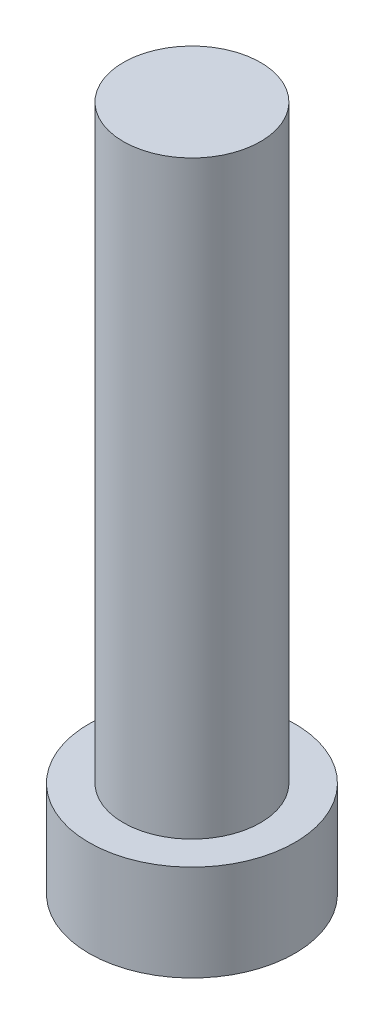
ISO-10303-21;
HEADER;
FILE_DESCRIPTION(('STEP AP214'),'2;1');
FILE_NAME('part.step','',(''),(''),'','','');
FILE_SCHEMA(('AUTOMOTIVE_DESIGN { 1 0 10303 214 1 1 1 1 }'));
ENDSEC;
DATA;
#1=APPLICATION_CONTEXT('core data for automotive mechanical design processes');
#2=APPLICATION_PROTOCOL_DEFINITION('international standard','automotive_design',2000,#1);
#3=PRODUCT_CONTEXT('',#1,'mechanical');
#4=PRODUCT('Part','Part','',(#3));
#5=PRODUCT_RELATED_PRODUCT_CATEGORY('part','',(#4));
#6=PRODUCT_DEFINITION_FORMATION('','',#4);
#7=PRODUCT_DEFINITION_CONTEXT('part definition',#1,'design');
#8=PRODUCT_DEFINITION('design','',#6,#7);
#9=PRODUCT_DEFINITION_SHAPE('','',#8);
#10=(LENGTH_UNIT() NAMED_UNIT(*) SI_UNIT(.MILLI.,.METRE.));
#11=(NAMED_UNIT(*) PLANE_ANGLE_UNIT() SI_UNIT($,.RADIAN.));
#12=(NAMED_UNIT(*) SI_UNIT($,.STERADIAN.) SOLID_ANGLE_UNIT());
#13=UNCERTAINTY_MEASURE_WITH_UNIT(LENGTH_MEASURE(1.E-05),#10,'distance_accuracy_value','');
#14=(GEOMETRIC_REPRESENTATION_CONTEXT(3) GLOBAL_UNCERTAINTY_ASSIGNED_CONTEXT((#13)) GLOBAL_UNIT_ASSIGNED_CONTEXT((#10,
#11,#12)) REPRESENTATION_CONTEXT('',''));
#15=CARTESIAN_POINT('',(0.,0.,0.));
#16=DIRECTION('',(0.,0.,1.));
#17=DIRECTION('',(1.,0.,0.));
#18=AXIS2_PLACEMENT_3D('',#15,#16,#17);
#19=CARTESIAN_POINT('',(0.,7.,0.));
#20=DIRECTION('',(0.,-1.,0.));
#21=DIRECTION('',(0.,0.,-1.));
#22=AXIS2_PLACEMENT_3D('',#19,#20,#21);
#23=CYLINDRICAL_SURFACE('',#22,7.5);
#24=CARTESIAN_POINT('',(0.,7.,0.));
#25=DIRECTION('',(0.,1.,0.));
#26=DIRECTION('',(0.,0.,1.));
#27=AXIS2_PLACEMENT_3D('',#24,#25,#26);
#28=CIRCLE('',#27,7.5);
#29=CARTESIAN_POINT('',(0.,7.,7.5));
#30=VERTEX_POINT('',#29);
#31=EDGE_CURVE('E44',#30,#30,#28,.T.);
#32=ORIENTED_EDGE('',*,*,#31,.F.);
#33=EDGE_LOOP('',(#32));
#34=FACE_BOUND('',#33,.T.);
#35=CARTESIAN_POINT('',(0.,0.,0.));
#36=DIRECTION('',(0.,1.,0.));
#37=DIRECTION('',(0.,0.,1.));
#38=AXIS2_PLACEMENT_3D('',#35,#36,#37);
#39=CIRCLE('',#38,7.5);
#40=CARTESIAN_POINT('',(0.,0.,7.5));
#41=VERTEX_POINT('',#40);
#42=EDGE_CURVE('E39',#41,#41,#39,.T.);
#43=ORIENTED_EDGE('',*,*,#42,.T.);
#44=EDGE_LOOP('',(#43));
#45=FACE_BOUND('',#44,.T.);
#46=ADVANCED_FACE('F36',(#34,#45),#23,.T.);
#47=CARTESIAN_POINT('',(0.,7.,0.));
#48=DIRECTION('',(0.,1.,0.));
#49=DIRECTION('',(0.,0.,1.));
#50=AXIS2_PLACEMENT_3D('',#47,#48,#49);
#51=PLANE('',#50);
#52=CARTESIAN_POINT('',(0.,7.,0.));
#53=DIRECTION('',(0.,1.,0.));
#54=DIRECTION('',(0.,0.,1.));
#55=AXIS2_PLACEMENT_3D('',#52,#53,#54);
#56=CIRCLE('',#55,5.);
#57=CARTESIAN_POINT('',(0.,7.,5.));
#58=VERTEX_POINT('',#57);
#59=EDGE_CURVE('E10',#58,#58,#56,.T.);
#60=ORIENTED_EDGE('',*,*,#59,.F.);
#61=EDGE_LOOP('',(#60));
#62=FACE_BOUND('',#61,.T.);
#63=ORIENTED_EDGE('',*,*,#31,.T.);
#64=EDGE_LOOP('',(#63));
#65=FACE_BOUND('',#64,.T.);
#66=ADVANCED_FACE('F67',(#62,#65),#51,.T.);
#67=CARTESIAN_POINT('',(0.,0.,0.));
#68=DIRECTION('',(0.,1.,0.));
#69=DIRECTION('',(0.,0.,1.));
#70=AXIS2_PLACEMENT_3D('',#67,#68,#69);
#71=PLANE('',#70);
#72=ORIENTED_EDGE('',*,*,#42,.F.);
#73=EDGE_LOOP('',(#72));
#74=FACE_BOUND('',#73,.T.);
#75=ADVANCED_FACE('F64',(#74),#71,.F.);
#76=CARTESIAN_POINT('',(0.,50.,0.));
#77=DIRECTION('',(0.,-1.,0.));
#78=DIRECTION('',(0.,0.,-1.));
#79=AXIS2_PLACEMENT_3D('',#76,#77,#78);
#80=CYLINDRICAL_SURFACE('',#79,5.);
#81=CARTESIAN_POINT('',(0.,50.,0.));
#82=DIRECTION('',(0.,1.,0.));
#83=DIRECTION('',(0.,0.,1.));
#84=AXIS2_PLACEMENT_3D('',#81,#82,#83);
#85=CIRCLE('',#84,5.);
#86=CARTESIAN_POINT('',(0.,50.,5.));
#87=VERTEX_POINT('',#86);
#88=EDGE_CURVE('E52',#87,#87,#85,.T.);
#89=ORIENTED_EDGE('',*,*,#88,.F.);
#90=EDGE_LOOP('',(#89));
#91=FACE_BOUND('',#90,.T.);
#92=ORIENTED_EDGE('',*,*,#59,.T.);
#93=EDGE_LOOP('',(#92));
#94=FACE_BOUND('',#93,.T.);
#95=ADVANCED_FACE('F66',(#91,#94),#80,.T.);
#96=CARTESIAN_POINT('',(0.,50.,0.));
#97=DIRECTION('',(0.,1.,0.));
#98=DIRECTION('',(0.,0.,1.));
#99=AXIS2_PLACEMENT_3D('',#96,#97,#98);
#100=PLANE('',#99);
#101=ORIENTED_EDGE('',*,*,#88,.T.);
#102=EDGE_LOOP('',(#101));
#103=FACE_BOUND('',#102,.T.);
#104=ADVANCED_FACE('F72',(#103),#100,.T.);
#105=CLOSED_SHELL('',(#46,#66,#75,#95,#104));
#106=MANIFOLD_SOLID_BREP('B2',#105);
#107=ADVANCED_BREP_SHAPE_REPRESENTATION('',(#18,#106),#14);
#108=SHAPE_DEFINITION_REPRESENTATION(#9,#107);
ENDSEC;
END-ISO-10303-21;
